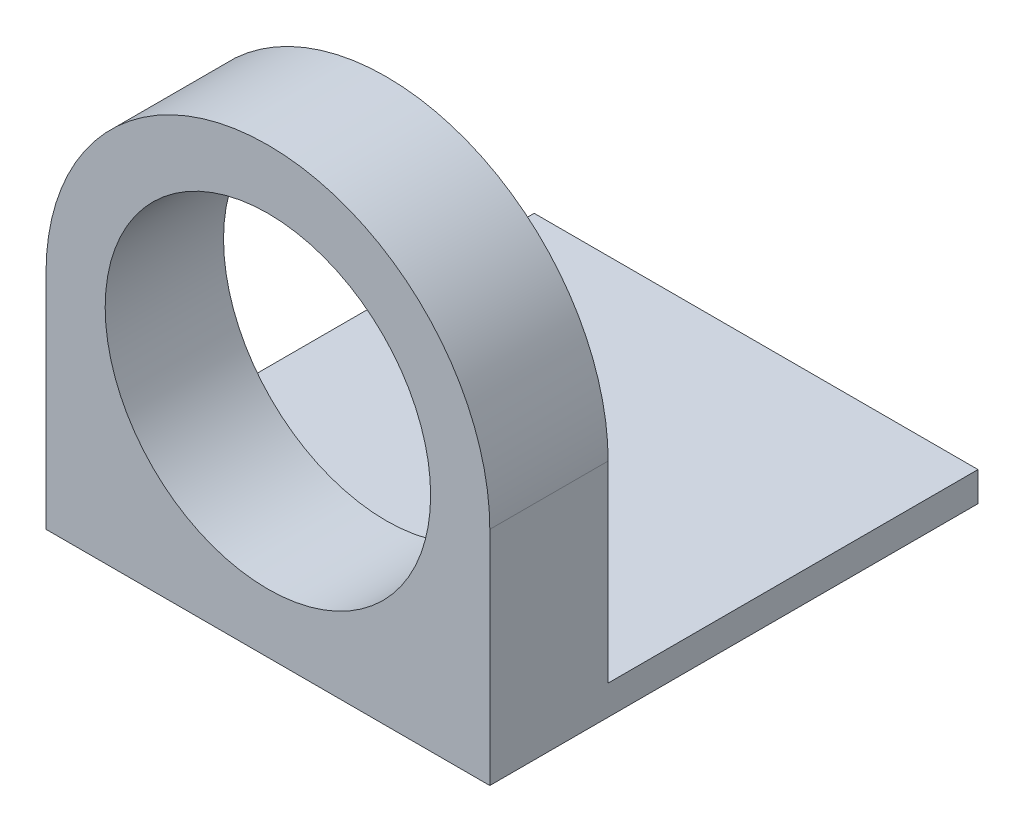
ISO-10303-21;
HEADER;
FILE_DESCRIPTION(('STEP AP214'),'2;1');
FILE_NAME('part.step','',(''),(''),'','','');
FILE_SCHEMA(('AUTOMOTIVE_DESIGN { 1 0 10303 214 1 1 1 1 }'));
ENDSEC;
DATA;
#1=APPLICATION_CONTEXT('core data for automotive mechanical design processes');
#2=APPLICATION_PROTOCOL_DEFINITION('international standard','automotive_design',2000,#1);
#3=PRODUCT_CONTEXT('',#1,'mechanical');
#4=PRODUCT('Part','Part','',(#3));
#5=PRODUCT_RELATED_PRODUCT_CATEGORY('part','',(#4));
#6=PRODUCT_DEFINITION_FORMATION('','',#4);
#7=PRODUCT_DEFINITION_CONTEXT('part definition',#1,'design');
#8=PRODUCT_DEFINITION('design','',#6,#7);
#9=PRODUCT_DEFINITION_SHAPE('','',#8);
#10=(LENGTH_UNIT() NAMED_UNIT(*) SI_UNIT(.MILLI.,.METRE.));
#11=(NAMED_UNIT(*) PLANE_ANGLE_UNIT() SI_UNIT($,.RADIAN.));
#12=(NAMED_UNIT(*) SI_UNIT($,.STERADIAN.) SOLID_ANGLE_UNIT());
#13=UNCERTAINTY_MEASURE_WITH_UNIT(LENGTH_MEASURE(1.E-05),#10,'distance_accuracy_value','');
#14=(GEOMETRIC_REPRESENTATION_CONTEXT(3) GLOBAL_UNCERTAINTY_ASSIGNED_CONTEXT((#13)) GLOBAL_UNIT_ASSIGNED_CONTEXT((#10,
#11,#12)) REPRESENTATION_CONTEXT('',''));
#15=CARTESIAN_POINT('',(0.,0.,0.));
#16=DIRECTION('',(0.,0.,1.));
#17=DIRECTION('',(1.,0.,0.));
#18=AXIS2_PLACEMENT_3D('',#15,#16,#17);
#19=CARTESIAN_POINT('',(0.,0.,0.));
#20=DIRECTION('',(0.,0.,1.));
#21=DIRECTION('',(1.,0.,0.));
#22=AXIS2_PLACEMENT_3D('',#19,#20,#21);
#23=PLANE('',#22);
#24=CARTESIAN_POINT('',(0.,0.,0.));
#25=DIRECTION('',(0.,0.,1.));
#26=DIRECTION('',(1.,0.,0.));
#27=AXIS2_PLACEMENT_3D('',#24,#25,#26);
#28=CIRCLE('',#27,11.);
#29=CARTESIAN_POINT('',(11.,0.,0.));
#30=VERTEX_POINT('',#29);
#31=EDGE_CURVE('E121',#30,#30,#28,.T.);
#32=ORIENTED_EDGE('',*,*,#31,.T.);
#33=EDGE_LOOP('',(#32));
#34=FACE_BOUND('',#33,.T.);
#35=DIRECTION('',(1.,0.,0.));
#36=VECTOR('',#35,1.);
#37=CARTESIAN_POINT('',(15.,-13.,0.));
#38=LINE('',#37,#36);
#39=CARTESIAN_POINT('',(-15.,-13.,0.));
#40=VERTEX_POINT('',#39);
#41=CARTESIAN_POINT('',(15.,-13.,0.));
#42=VERTEX_POINT('',#41);
#43=EDGE_CURVE('E48',#40,#42,#38,.T.);
#44=ORIENTED_EDGE('',*,*,#43,.F.);
#45=DIRECTION('',(0.,-1.,0.));
#46=VECTOR('',#45,1.);
#47=CARTESIAN_POINT('',(-15.,0.,0.));
#48=LINE('',#47,#46);
#49=CARTESIAN_POINT('',(-15.,0.,0.));
#50=VERTEX_POINT('',#49);
#51=EDGE_CURVE('E129',#50,#40,#48,.T.);
#52=ORIENTED_EDGE('',*,*,#51,.F.);
#53=CARTESIAN_POINT('',(0.,0.,0.));
#54=DIRECTION('',(0.,0.,1.));
#55=DIRECTION('',(1.,0.,0.));
#56=AXIS2_PLACEMENT_3D('',#53,#54,#55);
#57=CIRCLE('',#56,15.);
#58=CARTESIAN_POINT('',(15.,0.,0.));
#59=VERTEX_POINT('',#58);
#60=EDGE_CURVE('E74',#59,#50,#57,.T.);
#61=ORIENTED_EDGE('',*,*,#60,.F.);
#62=DIRECTION('',(0.,1.,0.));
#63=VECTOR('',#62,1.);
#64=CARTESIAN_POINT('',(15.,0.,0.));
#65=LINE('',#64,#63);
#66=EDGE_CURVE('E125',#42,#59,#65,.T.);
#67=ORIENTED_EDGE('',*,*,#66,.F.);
#68=EDGE_LOOP('',(#44,#52,#61,#67));
#69=FACE_BOUND('',#68,.T.);
#70=ADVANCED_FACE('F33',(#34,#69),#23,.F.);
#71=CARTESIAN_POINT('',(0.,0.,8.));
#72=DIRECTION('',(0.,0.,1.));
#73=DIRECTION('',(1.,0.,0.));
#74=AXIS2_PLACEMENT_3D('',#71,#72,#73);
#75=PLANE('',#74);
#76=DIRECTION('',(1.,0.,0.));
#77=VECTOR('',#76,1.);
#78=CARTESIAN_POINT('',(0.,-15.,8.));
#79=LINE('',#78,#77);
#80=CARTESIAN_POINT('',(-15.,-15.,8.));
#81=VERTEX_POINT('',#80);
#82=CARTESIAN_POINT('',(15.,-15.,8.));
#83=VERTEX_POINT('',#82);
#84=EDGE_CURVE('E57',#81,#83,#79,.T.);
#85=ORIENTED_EDGE('',*,*,#84,.T.);
#86=DIRECTION('',(0.,1.,0.));
#87=VECTOR('',#86,1.);
#88=CARTESIAN_POINT('',(15.,0.,8.));
#89=LINE('',#88,#87);
#90=CARTESIAN_POINT('',(15.,0.,8.));
#91=VERTEX_POINT('',#90);
#92=EDGE_CURVE('E81',#83,#91,#89,.T.);
#93=ORIENTED_EDGE('',*,*,#92,.T.);
#94=CARTESIAN_POINT('',(0.,0.,8.));
#95=DIRECTION('',(0.,0.,1.));
#96=DIRECTION('',(1.,0.,0.));
#97=AXIS2_PLACEMENT_3D('',#94,#95,#96);
#98=CIRCLE('',#97,15.);
#99=CARTESIAN_POINT('',(-15.,0.,8.));
#100=VERTEX_POINT('',#99);
#101=EDGE_CURVE('E131',#91,#100,#98,.T.);
#102=ORIENTED_EDGE('',*,*,#101,.T.);
#103=DIRECTION('',(0.,-1.,0.));
#104=VECTOR('',#103,1.);
#105=CARTESIAN_POINT('',(-15.,0.,8.));
#106=LINE('',#105,#104);
#107=EDGE_CURVE('E133',#100,#81,#106,.T.);
#108=ORIENTED_EDGE('',*,*,#107,.T.);
#109=EDGE_LOOP('',(#85,#93,#102,#108));
#110=FACE_BOUND('',#109,.T.);
#111=CARTESIAN_POINT('',(0.,0.,8.));
#112=DIRECTION('',(0.,0.,1.));
#113=DIRECTION('',(1.,0.,0.));
#114=AXIS2_PLACEMENT_3D('',#111,#112,#113);
#115=CIRCLE('',#114,11.);
#116=CARTESIAN_POINT('',(11.,0.,8.));
#117=VERTEX_POINT('',#116);
#118=EDGE_CURVE('E122',#117,#117,#115,.T.);
#119=ORIENTED_EDGE('',*,*,#118,.F.);
#120=EDGE_LOOP('',(#119));
#121=FACE_BOUND('',#120,.T.);
#122=ADVANCED_FACE('F159',(#110,#121),#75,.T.);
#123=CARTESIAN_POINT('',(15.,0.,8.));
#124=DIRECTION('',(-1.,0.,0.));
#125=DIRECTION('',(0.,0.,1.));
#126=AXIS2_PLACEMENT_3D('',#123,#124,#125);
#127=PLANE('',#126);
#128=DIRECTION('',(0.,0.,-1.));
#129=VECTOR('',#128,1.);
#130=CARTESIAN_POINT('',(15.,-15.,8.));
#131=LINE('',#130,#129);
#132=CARTESIAN_POINT('',(15.,-15.,-25.));
#133=VERTEX_POINT('',#132);
#134=EDGE_CURVE('E11',#83,#133,#131,.T.);
#135=ORIENTED_EDGE('',*,*,#134,.T.);
#136=DIRECTION('',(0.,-1.,0.));
#137=VECTOR('',#136,1.);
#138=CARTESIAN_POINT('',(15.,-15.,-25.));
#139=LINE('',#138,#137);
#140=CARTESIAN_POINT('',(15.,-13.,-25.));
#141=VERTEX_POINT('',#140);
#142=EDGE_CURVE('E97',#141,#133,#139,.T.);
#143=ORIENTED_EDGE('',*,*,#142,.F.);
#144=DIRECTION('',(0.,0.,1.));
#145=VECTOR('',#144,1.);
#146=CARTESIAN_POINT('',(15.,-13.,-25.));
#147=LINE('',#146,#145);
#148=EDGE_CURVE('E115',#141,#42,#147,.T.);
#149=ORIENTED_EDGE('',*,*,#148,.T.);
#150=ORIENTED_EDGE('',*,*,#66,.T.);
#151=DIRECTION('',(0.,0.,-1.));
#152=VECTOR('',#151,1.);
#153=CARTESIAN_POINT('',(15.,0.,8.));
#154=LINE('',#153,#152);
#155=EDGE_CURVE('E41',#91,#59,#154,.T.);
#156=ORIENTED_EDGE('',*,*,#155,.F.);
#157=ORIENTED_EDGE('',*,*,#92,.F.);
#158=EDGE_LOOP('',(#135,#143,#149,#150,#156,#157));
#159=FACE_BOUND('',#158,.T.);
#160=ADVANCED_FACE('F35',(#159),#127,.F.);
#161=CARTESIAN_POINT('',(0.,0.,8.));
#162=DIRECTION('',(0.,0.,-1.));
#163=DIRECTION('',(-1.,0.,0.));
#164=AXIS2_PLACEMENT_3D('',#161,#162,#163);
#165=CYLINDRICAL_SURFACE('',#164,15.);
#166=ORIENTED_EDGE('',*,*,#60,.T.);
#167=DIRECTION('',(0.,0.,-1.));
#168=VECTOR('',#167,1.);
#169=CARTESIAN_POINT('',(-15.,0.,8.));
#170=LINE('',#169,#168);
#171=EDGE_CURVE('E139',#100,#50,#170,.T.);
#172=ORIENTED_EDGE('',*,*,#171,.F.);
#173=ORIENTED_EDGE('',*,*,#101,.F.);
#174=ORIENTED_EDGE('',*,*,#155,.T.);
#175=EDGE_LOOP('',(#166,#172,#173,#174));
#176=FACE_BOUND('',#175,.T.);
#177=ADVANCED_FACE('F141',(#176),#165,.T.);
#178=CARTESIAN_POINT('',(-15.,0.,8.));
#179=DIRECTION('',(1.,0.,0.));
#180=DIRECTION('',(0.,0.,-1.));
#181=AXIS2_PLACEMENT_3D('',#178,#179,#180);
#182=PLANE('',#181);
#183=ORIENTED_EDGE('',*,*,#51,.T.);
#184=DIRECTION('',(0.,0.,1.));
#185=VECTOR('',#184,1.);
#186=CARTESIAN_POINT('',(-15.,-13.,-25.));
#187=LINE('',#186,#185);
#188=CARTESIAN_POINT('',(-15.,-13.,-25.));
#189=VERTEX_POINT('',#188);
#190=EDGE_CURVE('E118',#189,#40,#187,.T.);
#191=ORIENTED_EDGE('',*,*,#190,.F.);
#192=DIRECTION('',(0.,1.,0.));
#193=VECTOR('',#192,1.);
#194=CARTESIAN_POINT('',(-15.,-15.,-25.));
#195=LINE('',#194,#193);
#196=CARTESIAN_POINT('',(-15.,-15.,-25.));
#197=VERTEX_POINT('',#196);
#198=EDGE_CURVE('E105',#197,#189,#195,.T.);
#199=ORIENTED_EDGE('',*,*,#198,.F.);
#200=DIRECTION('',(0.,0.,-1.));
#201=VECTOR('',#200,1.);
#202=CARTESIAN_POINT('',(-15.,-15.,8.));
#203=LINE('',#202,#201);
#204=EDGE_CURVE('E102',#81,#197,#203,.T.);
#205=ORIENTED_EDGE('',*,*,#204,.F.);
#206=ORIENTED_EDGE('',*,*,#107,.F.);
#207=ORIENTED_EDGE('',*,*,#171,.T.);
#208=EDGE_LOOP('',(#183,#191,#199,#205,#206,#207));
#209=FACE_BOUND('',#208,.T.);
#210=ADVANCED_FACE('F144',(#209),#182,.F.);
#211=CARTESIAN_POINT('',(0.,-15.,8.));
#212=DIRECTION('',(0.,1.,0.));
#213=DIRECTION('',(0.,0.,1.));
#214=AXIS2_PLACEMENT_3D('',#211,#212,#213);
#215=PLANE('',#214);
#216=ORIENTED_EDGE('',*,*,#204,.T.);
#217=DIRECTION('',(-1.,0.,0.));
#218=VECTOR('',#217,1.);
#219=CARTESIAN_POINT('',(15.,-15.,-25.));
#220=LINE('',#219,#218);
#221=EDGE_CURVE('E99',#133,#197,#220,.T.);
#222=ORIENTED_EDGE('',*,*,#221,.F.);
#223=ORIENTED_EDGE('',*,*,#134,.F.);
#224=ORIENTED_EDGE('',*,*,#84,.F.);
#225=EDGE_LOOP('',(#216,#222,#223,#224));
#226=FACE_BOUND('',#225,.T.);
#227=ADVANCED_FACE('F100',(#226),#215,.F.);
#228=CARTESIAN_POINT('',(0.,0.,8.));
#229=DIRECTION('',(0.,0.,-1.));
#230=DIRECTION('',(-1.,0.,0.));
#231=AXIS2_PLACEMENT_3D('',#228,#229,#230);
#232=CYLINDRICAL_SURFACE('',#231,11.);
#233=ORIENTED_EDGE('',*,*,#118,.T.);
#234=EDGE_LOOP('',(#233));
#235=FACE_BOUND('',#234,.T.);
#236=ORIENTED_EDGE('',*,*,#31,.F.);
#237=EDGE_LOOP('',(#236));
#238=FACE_BOUND('',#237,.T.);
#239=ADVANCED_FACE('F149',(#235,#238),#232,.F.);
#240=CARTESIAN_POINT('',(15.,-13.,-25.));
#241=DIRECTION('',(0.,-1.,0.));
#242=DIRECTION('',(0.,0.,-1.));
#243=AXIS2_PLACEMENT_3D('',#240,#241,#242);
#244=PLANE('',#243);
#245=ORIENTED_EDGE('',*,*,#43,.T.);
#246=ORIENTED_EDGE('',*,*,#148,.F.);
#247=DIRECTION('',(1.,0.,0.));
#248=VECTOR('',#247,1.);
#249=CARTESIAN_POINT('',(15.,-13.,-25.));
#250=LINE('',#249,#248);
#251=EDGE_CURVE('E109',#189,#141,#250,.T.);
#252=ORIENTED_EDGE('',*,*,#251,.F.);
#253=ORIENTED_EDGE('',*,*,#190,.T.);
#254=EDGE_LOOP('',(#245,#246,#252,#253));
#255=FACE_BOUND('',#254,.T.);
#256=ADVANCED_FACE('F147',(#255),#244,.F.);
#257=CARTESIAN_POINT('',(0.,0.,-25.));
#258=DIRECTION('',(0.,0.,1.));
#259=DIRECTION('',(1.,0.,0.));
#260=AXIS2_PLACEMENT_3D('',#257,#258,#259);
#261=PLANE('',#260);
#262=ORIENTED_EDGE('',*,*,#142,.T.);
#263=ORIENTED_EDGE('',*,*,#221,.T.);
#264=ORIENTED_EDGE('',*,*,#198,.T.);
#265=ORIENTED_EDGE('',*,*,#251,.T.);
#266=EDGE_LOOP('',(#262,#263,#264,#265));
#267=FACE_BOUND('',#266,.T.);
#268=ADVANCED_FACE('F107',(#267),#261,.F.);
#269=CLOSED_SHELL('',(#70,#122,#160,#177,#210,#227,#239,#256,#268));
#270=MANIFOLD_SOLID_BREP('B2',#269);
#271=ADVANCED_BREP_SHAPE_REPRESENTATION('',(#18,#270),#14);
#272=SHAPE_DEFINITION_REPRESENTATION(#9,#271);
ENDSEC;
END-ISO-10303-21;
